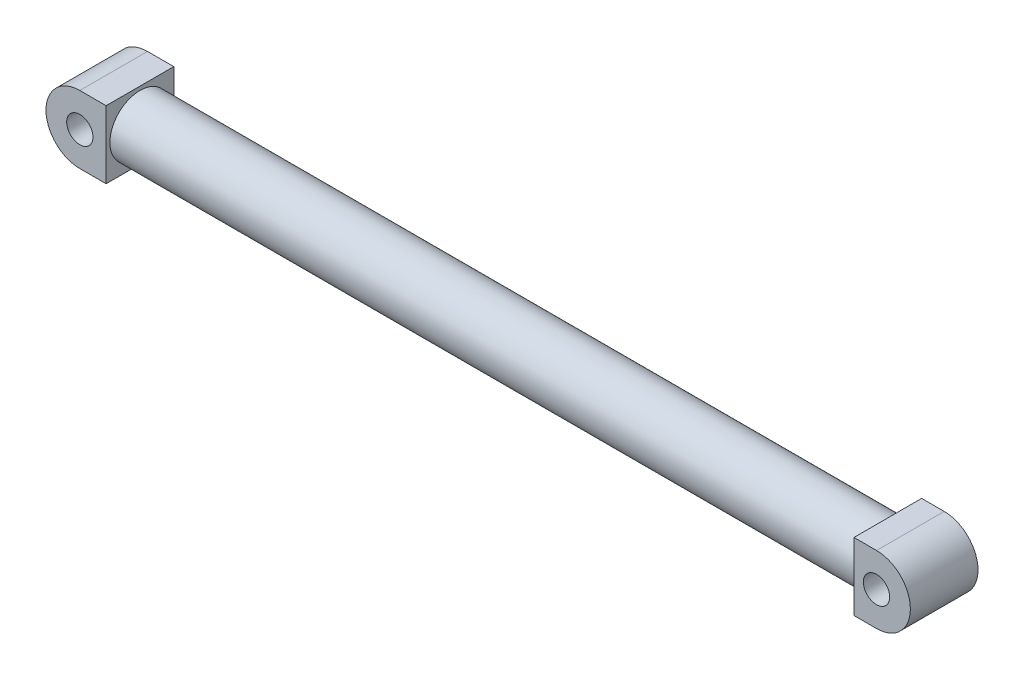
ISO-10303-21;
HEADER;
FILE_DESCRIPTION(('STEP AP214'),'2;1');
FILE_NAME('part.step','',(''),(''),'','','');
FILE_SCHEMA(('AUTOMOTIVE_DESIGN { 1 0 10303 214 1 1 1 1 }'));
ENDSEC;
DATA;
#1=APPLICATION_CONTEXT('core data for automotive mechanical design processes');
#2=APPLICATION_PROTOCOL_DEFINITION('international standard','automotive_design',2000,#1);
#3=PRODUCT_CONTEXT('',#1,'mechanical');
#4=PRODUCT('Part','Part','',(#3));
#5=PRODUCT_RELATED_PRODUCT_CATEGORY('part','',(#4));
#6=PRODUCT_DEFINITION_FORMATION('','',#4);
#7=PRODUCT_DEFINITION_CONTEXT('part definition',#1,'design');
#8=PRODUCT_DEFINITION('design','',#6,#7);
#9=PRODUCT_DEFINITION_SHAPE('','',#8);
#10=(LENGTH_UNIT() NAMED_UNIT(*) SI_UNIT(.MILLI.,.METRE.));
#11=(NAMED_UNIT(*) PLANE_ANGLE_UNIT() SI_UNIT($,.RADIAN.));
#12=(NAMED_UNIT(*) SI_UNIT($,.STERADIAN.) SOLID_ANGLE_UNIT());
#13=UNCERTAINTY_MEASURE_WITH_UNIT(LENGTH_MEASURE(1.E-05),#10,'distance_accuracy_value','');
#14=(GEOMETRIC_REPRESENTATION_CONTEXT(3) GLOBAL_UNCERTAINTY_ASSIGNED_CONTEXT((#13)) GLOBAL_UNIT_ASSIGNED_CONTEXT((#10,
#11,#12)) REPRESENTATION_CONTEXT('',''));
#15=CARTESIAN_POINT('',(0.,0.,0.));
#16=DIRECTION('',(0.,0.,1.));
#17=DIRECTION('',(1.,0.,0.));
#18=AXIS2_PLACEMENT_3D('',#15,#16,#17);
#19=CARTESIAN_POINT('',(0.,0.,9.));
#20=DIRECTION('',(0.,0.,1.));
#21=DIRECTION('',(1.,0.,0.));
#22=AXIS2_PLACEMENT_3D('',#19,#20,#21);
#23=PLANE('',#22);
#24=DIRECTION('',(0.,1.,0.));
#25=VECTOR('',#24,1.);
#26=CARTESIAN_POINT('',(103.,0.,9.));
#27=LINE('',#26,#25);
#28=CARTESIAN_POINT('',(103.,-4.5,9.));
#29=VERTEX_POINT('',#28);
#30=CARTESIAN_POINT('',(103.,4.5,9.));
#31=VERTEX_POINT('',#30);
#32=EDGE_CURVE('E70',#29,#31,#27,.T.);
#33=ORIENTED_EDGE('',*,*,#32,.F.);
#34=DIRECTION('',(1.,0.,0.));
#35=VECTOR('',#34,1.);
#36=CARTESIAN_POINT('',(0.,-4.5,9.));
#37=LINE('',#36,#35);
#38=CARTESIAN_POINT('',(106.,-4.5,9.));
#39=VERTEX_POINT('',#38);
#40=EDGE_CURVE('E238',#29,#39,#37,.T.);
#41=ORIENTED_EDGE('',*,*,#40,.T.);
#42=CARTESIAN_POINT('',(106.,0.,9.));
#43=DIRECTION('',(0.,0.,1.));
#44=DIRECTION('',(1.,0.,0.));
#45=AXIS2_PLACEMENT_3D('',#42,#43,#44);
#46=CIRCLE('',#45,4.5);
#47=CARTESIAN_POINT('',(106.,4.5,9.));
#48=VERTEX_POINT('',#47);
#49=EDGE_CURVE('E154',#39,#48,#46,.T.);
#50=ORIENTED_EDGE('',*,*,#49,.T.);
#51=DIRECTION('',(-1.,0.,0.));
#52=VECTOR('',#51,1.);
#53=CARTESIAN_POINT('',(0.,4.5,9.));
#54=LINE('',#53,#52);
#55=EDGE_CURVE('E153',#48,#31,#54,.T.);
#56=ORIENTED_EDGE('',*,*,#55,.T.);
#57=EDGE_LOOP('',(#33,#41,#50,#56));
#58=FACE_BOUND('',#57,.T.);
#59=CARTESIAN_POINT('',(106.,0.,9.));
#60=DIRECTION('',(0.,0.,1.));
#61=DIRECTION('',(1.,0.,0.));
#62=AXIS2_PLACEMENT_3D('',#59,#60,#61);
#63=CIRCLE('',#62,1.75);
#64=CARTESIAN_POINT('',(107.75,0.,9.));
#65=VERTEX_POINT('',#64);
#66=EDGE_CURVE('E224',#65,#65,#63,.T.);
#67=ORIENTED_EDGE('',*,*,#66,.F.);
#68=EDGE_LOOP('',(#67));
#69=FACE_BOUND('',#68,.T.);
#70=ADVANCED_FACE('F51',(#58,#69),#23,.T.);
#71=CARTESIAN_POINT('',(0.,0.,0.));
#72=DIRECTION('',(0.,0.,1.));
#73=DIRECTION('',(1.,0.,0.));
#74=AXIS2_PLACEMENT_3D('',#71,#72,#73);
#75=PLANE('',#74);
#76=DIRECTION('',(1.,0.,0.));
#77=VECTOR('',#76,1.);
#78=CARTESIAN_POINT('',(0.,-4.5,0.));
#79=LINE('',#78,#77);
#80=CARTESIAN_POINT('',(103.,-4.5,0.));
#81=VERTEX_POINT('',#80);
#82=CARTESIAN_POINT('',(106.,-4.5,0.));
#83=VERTEX_POINT('',#82);
#84=EDGE_CURVE('E166',#81,#83,#79,.T.);
#85=ORIENTED_EDGE('',*,*,#84,.F.);
#86=DIRECTION('',(0.,1.,0.));
#87=VECTOR('',#86,1.);
#88=CARTESIAN_POINT('',(103.,0.,0.));
#89=LINE('',#88,#87);
#90=CARTESIAN_POINT('',(103.,4.5,0.));
#91=VERTEX_POINT('',#90);
#92=EDGE_CURVE('E213',#81,#91,#89,.T.);
#93=ORIENTED_EDGE('',*,*,#92,.T.);
#94=DIRECTION('',(-1.,0.,0.));
#95=VECTOR('',#94,1.);
#96=CARTESIAN_POINT('',(0.,4.5,0.));
#97=LINE('',#96,#95);
#98=CARTESIAN_POINT('',(106.,4.5,0.));
#99=VERTEX_POINT('',#98);
#100=EDGE_CURVE('E176',#99,#91,#97,.T.);
#101=ORIENTED_EDGE('',*,*,#100,.F.);
#102=CARTESIAN_POINT('',(106.,0.,0.));
#103=DIRECTION('',(0.,0.,1.));
#104=DIRECTION('',(1.,0.,0.));
#105=AXIS2_PLACEMENT_3D('',#102,#103,#104);
#106=CIRCLE('',#105,4.5);
#107=EDGE_CURVE('E172',#83,#99,#106,.T.);
#108=ORIENTED_EDGE('',*,*,#107,.F.);
#109=EDGE_LOOP('',(#85,#93,#101,#108));
#110=FACE_BOUND('',#109,.T.);
#111=CARTESIAN_POINT('',(106.,0.,0.));
#112=DIRECTION('',(0.,0.,1.));
#113=DIRECTION('',(1.,0.,0.));
#114=AXIS2_PLACEMENT_3D('',#111,#112,#113);
#115=CIRCLE('',#114,1.75);
#116=CARTESIAN_POINT('',(107.75,0.,0.));
#117=VERTEX_POINT('',#116);
#118=EDGE_CURVE('E223',#117,#117,#115,.T.);
#119=ORIENTED_EDGE('',*,*,#118,.T.);
#120=EDGE_LOOP('',(#119));
#121=FACE_BOUND('',#120,.T.);
#122=ADVANCED_FACE('F258',(#110,#121),#75,.F.);
#123=CARTESIAN_POINT('',(0.,-4.5,9.));
#124=DIRECTION('',(0.,1.,0.));
#125=DIRECTION('',(0.,0.,1.));
#126=AXIS2_PLACEMENT_3D('',#123,#124,#125);
#127=PLANE('',#126);
#128=ORIENTED_EDGE('',*,*,#40,.F.);
#129=DIRECTION('',(0.,0.,-1.));
#130=VECTOR('',#129,1.);
#131=CARTESIAN_POINT('',(103.,-4.5,9.));
#132=LINE('',#131,#130);
#133=EDGE_CURVE('E219',#29,#81,#132,.T.);
#134=ORIENTED_EDGE('',*,*,#133,.T.);
#135=ORIENTED_EDGE('',*,*,#84,.T.);
#136=DIRECTION('',(0.,0.,-1.));
#137=VECTOR('',#136,1.);
#138=CARTESIAN_POINT('',(106.,-4.5,9.));
#139=LINE('',#138,#137);
#140=EDGE_CURVE('E187',#39,#83,#139,.T.);
#141=ORIENTED_EDGE('',*,*,#140,.F.);
#142=EDGE_LOOP('',(#128,#134,#135,#141));
#143=FACE_BOUND('',#142,.T.);
#144=ADVANCED_FACE('F247',(#143),#127,.F.);
#145=CARTESIAN_POINT('',(106.,0.,9.));
#146=DIRECTION('',(0.,0.,-1.));
#147=DIRECTION('',(-1.,0.,0.));
#148=AXIS2_PLACEMENT_3D('',#145,#146,#147);
#149=CYLINDRICAL_SURFACE('',#148,4.5);
#150=ORIENTED_EDGE('',*,*,#107,.T.);
#151=DIRECTION('',(0.,0.,-1.));
#152=VECTOR('',#151,1.);
#153=CARTESIAN_POINT('',(106.,4.5,9.));
#154=LINE('',#153,#152);
#155=EDGE_CURVE('E183',#48,#99,#154,.T.);
#156=ORIENTED_EDGE('',*,*,#155,.F.);
#157=ORIENTED_EDGE('',*,*,#49,.F.);
#158=ORIENTED_EDGE('',*,*,#140,.T.);
#159=EDGE_LOOP('',(#150,#156,#157,#158));
#160=FACE_BOUND('',#159,.T.);
#161=ADVANCED_FACE('F251',(#160),#149,.T.);
#162=CARTESIAN_POINT('',(0.,4.5,9.));
#163=DIRECTION('',(0.,-1.,0.));
#164=DIRECTION('',(0.,0.,-1.));
#165=AXIS2_PLACEMENT_3D('',#162,#163,#164);
#166=PLANE('',#165);
#167=ORIENTED_EDGE('',*,*,#100,.T.);
#168=DIRECTION('',(0.,0.,1.));
#169=VECTOR('',#168,1.);
#170=CARTESIAN_POINT('',(103.,4.5,9.));
#171=LINE('',#170,#169);
#172=EDGE_CURVE('E11',#91,#31,#171,.T.);
#173=ORIENTED_EDGE('',*,*,#172,.T.);
#174=ORIENTED_EDGE('',*,*,#55,.F.);
#175=ORIENTED_EDGE('',*,*,#155,.T.);
#176=EDGE_LOOP('',(#167,#173,#174,#175));
#177=FACE_BOUND('',#176,.T.);
#178=ADVANCED_FACE('F255',(#177),#166,.F.);
#179=CARTESIAN_POINT('',(106.,0.,9.));
#180=DIRECTION('',(0.,0.,-1.));
#181=DIRECTION('',(-1.,0.,0.));
#182=AXIS2_PLACEMENT_3D('',#179,#180,#181);
#183=CYLINDRICAL_SURFACE('',#182,1.75);
#184=ORIENTED_EDGE('',*,*,#66,.T.);
#185=EDGE_LOOP('',(#184));
#186=FACE_BOUND('',#185,.T.);
#187=ORIENTED_EDGE('',*,*,#118,.F.);
#188=EDGE_LOOP('',(#187));
#189=FACE_BOUND('',#188,.T.);
#190=ADVANCED_FACE('F265',(#186,#189),#183,.F.);
#191=CARTESIAN_POINT('',(103.,0.,4.5));
#192=DIRECTION('',(1.,0.,0.));
#193=DIRECTION('',(0.,0.,-1.));
#194=AXIS2_PLACEMENT_3D('',#191,#192,#193);
#195=PLANE('',#194);
#196=CARTESIAN_POINT('',(103.,0.,4.5));
#197=DIRECTION('',(1.,0.,0.));
#198=DIRECTION('',(0.,0.,-1.));
#199=AXIS2_PLACEMENT_3D('',#196,#197,#198);
#200=CIRCLE('',#199,4.);
#201=CARTESIAN_POINT('',(103.,0.,0.5));
#202=VERTEX_POINT('',#201);
#203=EDGE_CURVE('E203',#202,#202,#200,.T.);
#204=ORIENTED_EDGE('',*,*,#203,.T.);
#205=EDGE_LOOP('',(#204));
#206=FACE_BOUND('',#205,.T.);
#207=ORIENTED_EDGE('',*,*,#32,.T.);
#208=ORIENTED_EDGE('',*,*,#172,.F.);
#209=ORIENTED_EDGE('',*,*,#92,.F.);
#210=ORIENTED_EDGE('',*,*,#133,.F.);
#211=EDGE_LOOP('',(#207,#208,#209,#210));
#212=FACE_BOUND('',#211,.T.);
#213=ADVANCED_FACE('F256',(#206,#212),#195,.F.);
#214=CARTESIAN_POINT('',(3.5,0.,4.5));
#215=DIRECTION('',(1.,0.,0.));
#216=DIRECTION('',(0.,0.,-1.));
#217=AXIS2_PLACEMENT_3D('',#214,#215,#216);
#218=PLANE('',#217);
#219=CARTESIAN_POINT('',(3.5,0.,4.5));
#220=DIRECTION('',(1.,0.,0.));
#221=DIRECTION('',(0.,0.,-1.));
#222=AXIS2_PLACEMENT_3D('',#219,#220,#221);
#223=CIRCLE('',#222,4.);
#224=CARTESIAN_POINT('',(3.5,0.,0.5));
#225=VERTEX_POINT('',#224);
#226=EDGE_CURVE('E207',#225,#225,#223,.T.);
#227=ORIENTED_EDGE('',*,*,#226,.F.);
#228=EDGE_LOOP('',(#227));
#229=FACE_BOUND('',#228,.T.);
#230=DIRECTION('',(0.,0.,-1.));
#231=VECTOR('',#230,1.);
#232=CARTESIAN_POINT('',(3.5,-4.5,9.));
#233=LINE('',#232,#231);
#234=CARTESIAN_POINT('',(3.5,-4.5,9.));
#235=VERTEX_POINT('',#234);
#236=CARTESIAN_POINT('',(3.5,-4.5,0.));
#237=VERTEX_POINT('',#236);
#238=EDGE_CURVE('E146',#235,#237,#233,.T.);
#239=ORIENTED_EDGE('',*,*,#238,.T.);
#240=DIRECTION('',(0.,1.,0.));
#241=VECTOR('',#240,1.);
#242=CARTESIAN_POINT('',(3.5,0.,0.));
#243=LINE('',#242,#241);
#244=CARTESIAN_POINT('',(3.5,4.5,0.));
#245=VERTEX_POINT('',#244);
#246=EDGE_CURVE('E80',#237,#245,#243,.T.);
#247=ORIENTED_EDGE('',*,*,#246,.T.);
#248=DIRECTION('',(0.,0.,1.));
#249=VECTOR('',#248,1.);
#250=CARTESIAN_POINT('',(3.5,4.5,9.));
#251=LINE('',#250,#249);
#252=CARTESIAN_POINT('',(3.5,4.5,9.));
#253=VERTEX_POINT('',#252);
#254=EDGE_CURVE('E60',#245,#253,#251,.T.);
#255=ORIENTED_EDGE('',*,*,#254,.T.);
#256=DIRECTION('',(0.,1.,0.));
#257=VECTOR('',#256,1.);
#258=CARTESIAN_POINT('',(3.5,0.,9.));
#259=LINE('',#258,#257);
#260=EDGE_CURVE('E131',#235,#253,#259,.T.);
#261=ORIENTED_EDGE('',*,*,#260,.F.);
#262=EDGE_LOOP('',(#239,#247,#255,#261));
#263=FACE_BOUND('',#262,.T.);
#264=ADVANCED_FACE('F130',(#229,#263),#218,.T.);
#265=CARTESIAN_POINT('',(103.,0.,4.5));
#266=DIRECTION('',(-1.,0.,0.));
#267=DIRECTION('',(0.,0.,1.));
#268=AXIS2_PLACEMENT_3D('',#265,#266,#267);
#269=CYLINDRICAL_SURFACE('',#268,4.);
#270=ORIENTED_EDGE('',*,*,#203,.F.);
#271=EDGE_LOOP('',(#270));
#272=FACE_BOUND('',#271,.T.);
#273=ORIENTED_EDGE('',*,*,#226,.T.);
#274=EDGE_LOOP('',(#273));
#275=FACE_BOUND('',#274,.T.);
#276=ADVANCED_FACE('F293',(#272,#275),#269,.T.);
#277=CARTESIAN_POINT('',(0.,0.,9.));
#278=DIRECTION('',(0.,0.,-1.));
#279=DIRECTION('',(-1.,0.,0.));
#280=AXIS2_PLACEMENT_3D('',#277,#278,#279);
#281=CYLINDRICAL_SURFACE('',#280,1.75);
#282=CARTESIAN_POINT('',(0.,0.,9.));
#283=DIRECTION('',(0.,0.,1.));
#284=DIRECTION('',(1.,0.,0.));
#285=AXIS2_PLACEMENT_3D('',#282,#283,#284);
#286=CIRCLE('',#285,1.75);
#287=CARTESIAN_POINT('',(1.75,0.,9.));
#288=VERTEX_POINT('',#287);
#289=EDGE_CURVE('E167',#288,#288,#286,.T.);
#290=ORIENTED_EDGE('',*,*,#289,.T.);
#291=EDGE_LOOP('',(#290));
#292=FACE_BOUND('',#291,.T.);
#293=CARTESIAN_POINT('',(0.,0.,0.));
#294=DIRECTION('',(0.,0.,1.));
#295=DIRECTION('',(1.,0.,0.));
#296=AXIS2_PLACEMENT_3D('',#293,#294,#295);
#297=CIRCLE('',#296,1.75);
#298=CARTESIAN_POINT('',(1.75,0.,0.));
#299=VERTEX_POINT('',#298);
#300=EDGE_CURVE('E228',#299,#299,#297,.T.);
#301=ORIENTED_EDGE('',*,*,#300,.F.);
#302=EDGE_LOOP('',(#301));
#303=FACE_BOUND('',#302,.T.);
#304=ADVANCED_FACE('F290',(#292,#303),#281,.F.);
#305=CARTESIAN_POINT('',(0.,0.,9.));
#306=DIRECTION('',(0.,0.,-1.));
#307=DIRECTION('',(-1.,0.,0.));
#308=AXIS2_PLACEMENT_3D('',#305,#306,#307);
#309=CYLINDRICAL_SURFACE('',#308,4.5);
#310=CARTESIAN_POINT('',(0.,0.,0.));
#311=DIRECTION('',(0.,0.,1.));
#312=DIRECTION('',(1.,0.,0.));
#313=AXIS2_PLACEMENT_3D('',#310,#311,#312);
#314=CIRCLE('',#313,4.5);
#315=CARTESIAN_POINT('',(0.,4.5,0.));
#316=VERTEX_POINT('',#315);
#317=CARTESIAN_POINT('',(0.,-4.5,0.));
#318=VERTEX_POINT('',#317);
#319=EDGE_CURVE('E162',#316,#318,#314,.T.);
#320=ORIENTED_EDGE('',*,*,#319,.T.);
#321=DIRECTION('',(0.,0.,-1.));
#322=VECTOR('',#321,1.);
#323=CARTESIAN_POINT('',(0.,-4.5,9.));
#324=LINE('',#323,#322);
#325=CARTESIAN_POINT('',(0.,-4.5,9.));
#326=VERTEX_POINT('',#325);
#327=EDGE_CURVE('E137',#326,#318,#324,.T.);
#328=ORIENTED_EDGE('',*,*,#327,.F.);
#329=CARTESIAN_POINT('',(0.,0.,9.));
#330=DIRECTION('',(0.,0.,1.));
#331=DIRECTION('',(1.,0.,0.));
#332=AXIS2_PLACEMENT_3D('',#329,#330,#331);
#333=CIRCLE('',#332,4.5);
#334=CARTESIAN_POINT('',(0.,4.5,9.));
#335=VERTEX_POINT('',#334);
#336=EDGE_CURVE('E180',#335,#326,#333,.T.);
#337=ORIENTED_EDGE('',*,*,#336,.F.);
#338=DIRECTION('',(0.,0.,-1.));
#339=VECTOR('',#338,1.);
#340=CARTESIAN_POINT('',(0.,4.5,9.));
#341=LINE('',#340,#339);
#342=EDGE_CURVE('E150',#335,#316,#341,.T.);
#343=ORIENTED_EDGE('',*,*,#342,.T.);
#344=EDGE_LOOP('',(#320,#328,#337,#343));
#345=FACE_BOUND('',#344,.T.);
#346=ADVANCED_FACE('F53',(#345),#309,.T.);
#347=ORIENTED_EDGE('',*,*,#254,.F.);
#348=EDGE_CURVE('E175',#245,#316,#97,.T.);
#349=ORIENTED_EDGE('',*,*,#348,.T.);
#350=ORIENTED_EDGE('',*,*,#342,.F.);
#351=EDGE_CURVE('E142',#253,#335,#54,.T.);
#352=ORIENTED_EDGE('',*,*,#351,.F.);
#353=EDGE_LOOP('',(#347,#349,#350,#352));
#354=FACE_BOUND('',#353,.T.);
#355=ADVANCED_FACE('F148',(#354),#166,.F.);
#356=ORIENTED_EDGE('',*,*,#238,.F.);
#357=EDGE_CURVE('E144',#326,#235,#37,.T.);
#358=ORIENTED_EDGE('',*,*,#357,.F.);
#359=ORIENTED_EDGE('',*,*,#327,.T.);
#360=EDGE_CURVE('E168',#318,#237,#79,.T.);
#361=ORIENTED_EDGE('',*,*,#360,.T.);
#362=EDGE_LOOP('',(#356,#358,#359,#361));
#363=FACE_BOUND('',#362,.T.);
#364=ADVANCED_FACE('F197',(#363),#127,.F.);
#365=ORIENTED_EDGE('',*,*,#300,.T.);
#366=EDGE_LOOP('',(#365));
#367=FACE_BOUND('',#366,.T.);
#368=ORIENTED_EDGE('',*,*,#246,.F.);
#369=ORIENTED_EDGE('',*,*,#360,.F.);
#370=ORIENTED_EDGE('',*,*,#319,.F.);
#371=ORIENTED_EDGE('',*,*,#348,.F.);
#372=EDGE_LOOP('',(#368,#369,#370,#371));
#373=FACE_BOUND('',#372,.T.);
#374=ADVANCED_FACE('F201',(#367,#373),#75,.F.);
#375=ORIENTED_EDGE('',*,*,#289,.F.);
#376=EDGE_LOOP('',(#375));
#377=FACE_BOUND('',#376,.T.);
#378=ORIENTED_EDGE('',*,*,#357,.T.);
#379=ORIENTED_EDGE('',*,*,#260,.T.);
#380=ORIENTED_EDGE('',*,*,#351,.T.);
#381=ORIENTED_EDGE('',*,*,#336,.T.);
#382=EDGE_LOOP('',(#378,#379,#380,#381));
#383=FACE_BOUND('',#382,.T.);
#384=ADVANCED_FACE('F140',(#377,#383),#23,.T.);
#385=CLOSED_SHELL('',(#70,#122,#144,#161,#178,#190,#213,#264,#276,#304,#346,#355,#364,#374,#384));
#386=MANIFOLD_SOLID_BREP('B2',#385);
#387=ADVANCED_BREP_SHAPE_REPRESENTATION('',(#18,#386),#14);
#388=SHAPE_DEFINITION_REPRESENTATION(#9,#387);
ENDSEC;
END-ISO-10303-21;
